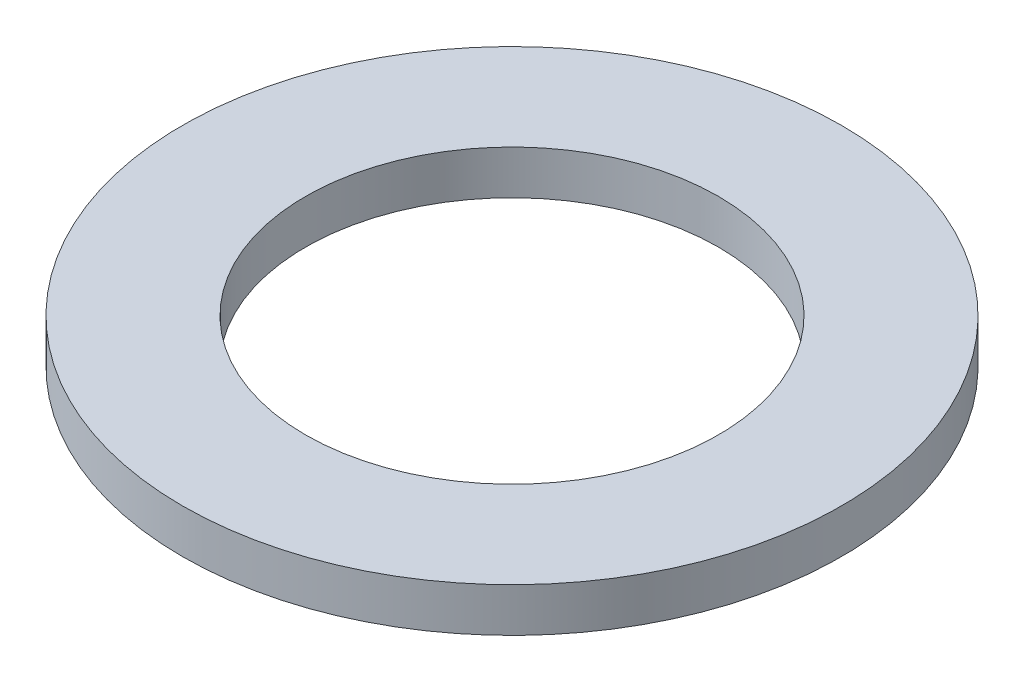
ISO-10303-21;
HEADER;
FILE_DESCRIPTION(('STEP AP214'),'2;1');
FILE_NAME('part.step','',(''),(''),'','','');
FILE_SCHEMA(('AUTOMOTIVE_DESIGN { 1 0 10303 214 1 1 1 1 }'));
ENDSEC;
DATA;
#1=APPLICATION_CONTEXT('core data for automotive mechanical design processes');
#2=APPLICATION_PROTOCOL_DEFINITION('international standard','automotive_design',2000,#1);
#3=PRODUCT_CONTEXT('',#1,'mechanical');
#4=PRODUCT('Part','Part','',(#3));
#5=PRODUCT_RELATED_PRODUCT_CATEGORY('part','',(#4));
#6=PRODUCT_DEFINITION_FORMATION('','',#4);
#7=PRODUCT_DEFINITION_CONTEXT('part definition',#1,'design');
#8=PRODUCT_DEFINITION('design','',#6,#7);
#9=PRODUCT_DEFINITION_SHAPE('','',#8);
#10=(LENGTH_UNIT() NAMED_UNIT(*) SI_UNIT(.MILLI.,.METRE.));
#11=(NAMED_UNIT(*) PLANE_ANGLE_UNIT() SI_UNIT($,.RADIAN.));
#12=(NAMED_UNIT(*) SI_UNIT($,.STERADIAN.) SOLID_ANGLE_UNIT());
#13=UNCERTAINTY_MEASURE_WITH_UNIT(LENGTH_MEASURE(1.E-05),#10,'distance_accuracy_value','');
#14=(GEOMETRIC_REPRESENTATION_CONTEXT(3) GLOBAL_UNCERTAINTY_ASSIGNED_CONTEXT((#13)) GLOBAL_UNIT_ASSIGNED_CONTEXT((#10,
#11,#12)) REPRESENTATION_CONTEXT('',''));
#15=CARTESIAN_POINT('',(0.,0.,0.));
#16=DIRECTION('',(0.,0.,1.));
#17=DIRECTION('',(1.,0.,0.));
#18=AXIS2_PLACEMENT_3D('',#15,#16,#17);
#19=CARTESIAN_POINT('',(0.,1.,0.));
#20=DIRECTION('',(0.,1.,0.));
#21=DIRECTION('',(0.,0.,1.));
#22=AXIS2_PLACEMENT_3D('',#19,#20,#21);
#23=PLANE('',#22);
#24=CARTESIAN_POINT('',(0.,1.,0.));
#25=DIRECTION('',(0.,1.,0.));
#26=DIRECTION('',(0.,0.,1.));
#27=AXIS2_PLACEMENT_3D('',#24,#25,#26);
#28=CIRCLE('',#27,7.5);
#29=CARTESIAN_POINT('',(0.,1.,7.5));
#30=VERTEX_POINT('',#29);
#31=EDGE_CURVE('E10',#30,#30,#28,.T.);
#32=ORIENTED_EDGE('',*,*,#31,.T.);
#33=EDGE_LOOP('',(#32));
#34=FACE_BOUND('',#33,.T.);
#35=CARTESIAN_POINT('',(0.,1.,0.));
#36=DIRECTION('',(0.,1.,0.));
#37=DIRECTION('',(0.,0.,1.));
#38=AXIS2_PLACEMENT_3D('',#35,#36,#37);
#39=CIRCLE('',#38,4.7);
#40=CARTESIAN_POINT('',(0.,1.,4.7));
#41=VERTEX_POINT('',#40);
#42=EDGE_CURVE('E50',#41,#41,#39,.T.);
#43=ORIENTED_EDGE('',*,*,#42,.F.);
#44=EDGE_LOOP('',(#43));
#45=FACE_BOUND('',#44,.T.);
#46=ADVANCED_FACE('F37',(#34,#45),#23,.T.);
#47=CARTESIAN_POINT('',(0.,0.,0.));
#48=DIRECTION('',(0.,1.,0.));
#49=DIRECTION('',(0.,0.,1.));
#50=AXIS2_PLACEMENT_3D('',#47,#48,#49);
#51=PLANE('',#50);
#52=CARTESIAN_POINT('',(0.,0.,0.));
#53=DIRECTION('',(0.,1.,0.));
#54=DIRECTION('',(0.,0.,1.));
#55=AXIS2_PLACEMENT_3D('',#52,#53,#54);
#56=CIRCLE('',#55,7.5);
#57=CARTESIAN_POINT('',(0.,0.,7.5));
#58=VERTEX_POINT('',#57);
#59=EDGE_CURVE('E41',#58,#58,#56,.T.);
#60=ORIENTED_EDGE('',*,*,#59,.F.);
#61=EDGE_LOOP('',(#60));
#62=FACE_BOUND('',#61,.T.);
#63=CARTESIAN_POINT('',(0.,0.,0.));
#64=DIRECTION('',(0.,1.,0.));
#65=DIRECTION('',(0.,0.,1.));
#66=AXIS2_PLACEMENT_3D('',#63,#64,#65);
#67=CIRCLE('',#66,4.7);
#68=CARTESIAN_POINT('',(0.,0.,4.7));
#69=VERTEX_POINT('',#68);
#70=EDGE_CURVE('E52',#69,#69,#67,.T.);
#71=ORIENTED_EDGE('',*,*,#70,.T.);
#72=EDGE_LOOP('',(#71));
#73=FACE_BOUND('',#72,.T.);
#74=ADVANCED_FACE('F64',(#62,#73),#51,.F.);
#75=CARTESIAN_POINT('',(0.,1.,0.));
#76=DIRECTION('',(0.,-1.,0.));
#77=DIRECTION('',(0.,0.,-1.));
#78=AXIS2_PLACEMENT_3D('',#75,#76,#77);
#79=CYLINDRICAL_SURFACE('',#78,7.5);
#80=ORIENTED_EDGE('',*,*,#31,.F.);
#81=EDGE_LOOP('',(#80));
#82=FACE_BOUND('',#81,.T.);
#83=ORIENTED_EDGE('',*,*,#59,.T.);
#84=EDGE_LOOP('',(#83));
#85=FACE_BOUND('',#84,.T.);
#86=ADVANCED_FACE('F39',(#82,#85),#79,.T.);
#87=CARTESIAN_POINT('',(0.,1.,0.));
#88=DIRECTION('',(0.,-1.,0.));
#89=DIRECTION('',(0.,0.,-1.));
#90=AXIS2_PLACEMENT_3D('',#87,#88,#89);
#91=CYLINDRICAL_SURFACE('',#90,4.7);
#92=ORIENTED_EDGE('',*,*,#42,.T.);
#93=EDGE_LOOP('',(#92));
#94=FACE_BOUND('',#93,.T.);
#95=ORIENTED_EDGE('',*,*,#70,.F.);
#96=EDGE_LOOP('',(#95));
#97=FACE_BOUND('',#96,.T.);
#98=ADVANCED_FACE('F60',(#94,#97),#91,.F.);
#99=CLOSED_SHELL('',(#46,#74,#86,#98));
#100=MANIFOLD_SOLID_BREP('B2',#99);
#101=ADVANCED_BREP_SHAPE_REPRESENTATION('',(#18,#100),#14);
#102=SHAPE_DEFINITION_REPRESENTATION(#9,#101);
ENDSEC;
END-ISO-10303-21;
